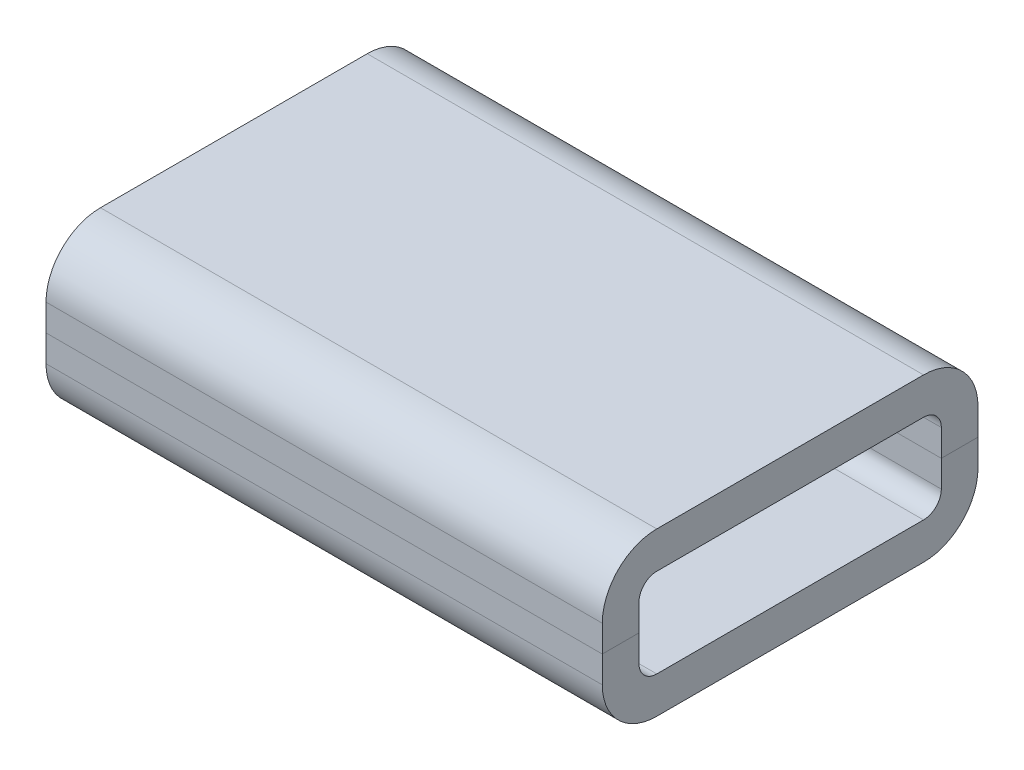
ISO-10303-21;
HEADER;
FILE_DESCRIPTION(('STEP AP214'),'2;1');
FILE_NAME('part.step','',(''),(''),'','','');
FILE_SCHEMA(('AUTOMOTIVE_DESIGN { 1 0 10303 214 1 1 1 1 }'));
ENDSEC;
DATA;
#1=APPLICATION_CONTEXT('core data for automotive mechanical design processes');
#2=APPLICATION_PROTOCOL_DEFINITION('international standard','automotive_design',2000,#1);
#3=PRODUCT_CONTEXT('',#1,'mechanical');
#4=PRODUCT('Part','Part','',(#3));
#5=PRODUCT_RELATED_PRODUCT_CATEGORY('part','',(#4));
#6=PRODUCT_DEFINITION_FORMATION('','',#4);
#7=PRODUCT_DEFINITION_CONTEXT('part definition',#1,'design');
#8=PRODUCT_DEFINITION('design','',#6,#7);
#9=PRODUCT_DEFINITION_SHAPE('','',#8);
#10=(LENGTH_UNIT() NAMED_UNIT(*) SI_UNIT(.MILLI.,.METRE.));
#11=(NAMED_UNIT(*) PLANE_ANGLE_UNIT() SI_UNIT($,.RADIAN.));
#12=(NAMED_UNIT(*) SI_UNIT($,.STERADIAN.) SOLID_ANGLE_UNIT());
#13=UNCERTAINTY_MEASURE_WITH_UNIT(LENGTH_MEASURE(1.E-05),#10,'distance_accuracy_value','');
#14=(GEOMETRIC_REPRESENTATION_CONTEXT(3) GLOBAL_UNCERTAINTY_ASSIGNED_CONTEXT((#13)) GLOBAL_UNIT_ASSIGNED_CONTEXT((#10,
#11,#12)) REPRESENTATION_CONTEXT('',''));
#15=CARTESIAN_POINT('',(0.,0.,0.));
#16=DIRECTION('',(0.,0.,1.));
#17=DIRECTION('',(1.,0.,0.));
#18=AXIS2_PLACEMENT_3D('',#15,#16,#17);
#19=CARTESIAN_POINT('',(25.025,0.,13.6));
#20=DIRECTION('',(0.,-1.,0.));
#21=DIRECTION('',(0.,0.,1.));
#22=AXIS2_PLACEMENT_3D('',#19,#20,#21);
#23=PLANE('',#22);
#24=DIRECTION('',(0.,0.,-1.));
#25=VECTOR('',#24,1.);
#26=CARTESIAN_POINT('',(-25.025,0.,13.6));
#27=LINE('',#26,#25);
#28=CARTESIAN_POINT('',(-25.025,0.,16.9));
#29=VERTEX_POINT('',#28);
#30=CARTESIAN_POINT('',(-25.025,0.,13.6));
#31=VERTEX_POINT('',#30);
#32=EDGE_CURVE('E169',#29,#31,#27,.T.);
#33=ORIENTED_EDGE('',*,*,#32,.F.);
#34=DIRECTION('',(-1.,0.,0.));
#35=VECTOR('',#34,1.);
#36=CARTESIAN_POINT('',(25.025,0.,16.9));
#37=LINE('',#36,#35);
#38=CARTESIAN_POINT('',(25.025,0.,16.9));
#39=VERTEX_POINT('',#38);
#40=EDGE_CURVE('E168',#39,#29,#37,.T.);
#41=ORIENTED_EDGE('',*,*,#40,.F.);
#42=DIRECTION('',(0.,0.,-1.));
#43=VECTOR('',#42,1.);
#44=CARTESIAN_POINT('',(25.025,0.,13.6));
#45=LINE('',#44,#43);
#46=CARTESIAN_POINT('',(25.025,0.,13.6));
#47=VERTEX_POINT('',#46);
#48=EDGE_CURVE('E199',#39,#47,#45,.T.);
#49=ORIENTED_EDGE('',*,*,#48,.T.);
#50=DIRECTION('',(-1.,0.,0.));
#51=VECTOR('',#50,1.);
#52=CARTESIAN_POINT('',(25.025,0.,13.6));
#53=LINE('',#52,#51);
#54=EDGE_CURVE('E12',#47,#31,#53,.T.);
#55=ORIENTED_EDGE('',*,*,#54,.T.);
#56=EDGE_LOOP('',(#33,#41,#49,#55));
#57=FACE_BOUND('',#56,.T.);
#58=ADVANCED_FACE('F49',(#57),#23,.F.);
#59=CARTESIAN_POINT('',(25.025,0.,13.6));
#60=DIRECTION('',(0.,0.,1.));
#61=DIRECTION('',(1.,0.,0.));
#62=AXIS2_PLACEMENT_3D('',#59,#60,#61);
#63=PLANE('',#62);
#64=DIRECTION('',(0.,-1.,0.));
#65=VECTOR('',#64,1.);
#66=CARTESIAN_POINT('',(-25.025,0.,13.6));
#67=LINE('',#66,#65);
#68=CARTESIAN_POINT('',(-25.025,-2.4,13.6));
#69=VERTEX_POINT('',#68);
#70=EDGE_CURVE('E171',#31,#69,#67,.T.);
#71=ORIENTED_EDGE('',*,*,#70,.F.);
#72=ORIENTED_EDGE('',*,*,#54,.F.);
#73=DIRECTION('',(0.,-1.,0.));
#74=VECTOR('',#73,1.);
#75=CARTESIAN_POINT('',(25.025,0.,13.6));
#76=LINE('',#75,#74);
#77=CARTESIAN_POINT('',(25.025,-2.4,13.6));
#78=VERTEX_POINT('',#77);
#79=EDGE_CURVE('E115',#47,#78,#76,.T.);
#80=ORIENTED_EDGE('',*,*,#79,.T.);
#81=DIRECTION('',(-1.,0.,0.));
#82=VECTOR('',#81,1.);
#83=CARTESIAN_POINT('',(25.025,-2.4,13.6));
#84=LINE('',#83,#82);
#85=EDGE_CURVE('E57',#78,#69,#84,.T.);
#86=ORIENTED_EDGE('',*,*,#85,.T.);
#87=EDGE_LOOP('',(#71,#72,#80,#86));
#88=FACE_BOUND('',#87,.T.);
#89=ADVANCED_FACE('F223',(#88),#63,.F.);
#90=CARTESIAN_POINT('',(25.025,-2.4,12.));
#91=DIRECTION('',(-1.,0.,0.));
#92=DIRECTION('',(0.,0.,1.));
#93=AXIS2_PLACEMENT_3D('',#90,#91,#92);
#94=CYLINDRICAL_SURFACE('',#93,1.6);
#95=CARTESIAN_POINT('',(-25.025,-2.4,12.));
#96=DIRECTION('',(1.,0.,0.));
#97=DIRECTION('',(0.,0.,1.));
#98=AXIS2_PLACEMENT_3D('',#95,#96,#97);
#99=CIRCLE('',#98,1.6);
#100=CARTESIAN_POINT('',(-25.025,-4.,12.));
#101=VERTEX_POINT('',#100);
#102=EDGE_CURVE('E174',#69,#101,#99,.T.);
#103=ORIENTED_EDGE('',*,*,#102,.F.);
#104=ORIENTED_EDGE('',*,*,#85,.F.);
#105=CARTESIAN_POINT('',(25.025,-2.4,12.));
#106=DIRECTION('',(1.,0.,0.));
#107=DIRECTION('',(0.,0.,1.));
#108=AXIS2_PLACEMENT_3D('',#105,#106,#107);
#109=CIRCLE('',#108,1.6);
#110=CARTESIAN_POINT('',(25.025,-4.,12.));
#111=VERTEX_POINT('',#110);
#112=EDGE_CURVE('E232',#78,#111,#109,.T.);
#113=ORIENTED_EDGE('',*,*,#112,.T.);
#114=DIRECTION('',(-1.,0.,0.));
#115=VECTOR('',#114,1.);
#116=CARTESIAN_POINT('',(25.025,-4.,12.));
#117=LINE('',#116,#115);
#118=EDGE_CURVE('E218',#111,#101,#117,.T.);
#119=ORIENTED_EDGE('',*,*,#118,.T.);
#120=EDGE_LOOP('',(#103,#104,#113,#119));
#121=FACE_BOUND('',#120,.T.);
#122=ADVANCED_FACE('F266',(#121),#94,.F.);
#123=CARTESIAN_POINT('',(25.025,-4.,12.));
#124=DIRECTION('',(0.,-1.,0.));
#125=DIRECTION('',(0.,0.,1.));
#126=AXIS2_PLACEMENT_3D('',#123,#124,#125);
#127=PLANE('',#126);
#128=DIRECTION('',(0.,0.,-1.));
#129=VECTOR('',#128,1.);
#130=CARTESIAN_POINT('',(-25.025,-4.,12.));
#131=LINE('',#130,#129);
#132=CARTESIAN_POINT('',(-25.025,-4.,-12.));
#133=VERTEX_POINT('',#132);
#134=EDGE_CURVE('E177',#101,#133,#131,.T.);
#135=ORIENTED_EDGE('',*,*,#134,.F.);
#136=ORIENTED_EDGE('',*,*,#118,.F.);
#137=DIRECTION('',(0.,0.,-1.));
#138=VECTOR('',#137,1.);
#139=CARTESIAN_POINT('',(25.025,-4.,12.));
#140=LINE('',#139,#138);
#141=CARTESIAN_POINT('',(25.025,-4.,-12.));
#142=VERTEX_POINT('',#141);
#143=EDGE_CURVE('E236',#111,#142,#140,.T.);
#144=ORIENTED_EDGE('',*,*,#143,.T.);
#145=DIRECTION('',(-1.,0.,0.));
#146=VECTOR('',#145,1.);
#147=CARTESIAN_POINT('',(25.025,-4.,-12.));
#148=LINE('',#147,#146);
#149=EDGE_CURVE('E215',#142,#133,#148,.T.);
#150=ORIENTED_EDGE('',*,*,#149,.T.);
#151=EDGE_LOOP('',(#135,#136,#144,#150));
#152=FACE_BOUND('',#151,.T.);
#153=ADVANCED_FACE('F265',(#152),#127,.F.);
#154=CARTESIAN_POINT('',(25.025,-2.4,-12.));
#155=DIRECTION('',(-1.,0.,0.));
#156=DIRECTION('',(0.,0.,1.));
#157=AXIS2_PLACEMENT_3D('',#154,#155,#156);
#158=CYLINDRICAL_SURFACE('',#157,1.6);
#159=CARTESIAN_POINT('',(-25.025,-2.4,-12.));
#160=DIRECTION('',(1.,0.,0.));
#161=DIRECTION('',(0.,0.,1.));
#162=AXIS2_PLACEMENT_3D('',#159,#160,#161);
#163=CIRCLE('',#162,1.6);
#164=CARTESIAN_POINT('',(-25.025,-2.4,-13.6));
#165=VERTEX_POINT('',#164);
#166=EDGE_CURVE('E180',#133,#165,#163,.T.);
#167=ORIENTED_EDGE('',*,*,#166,.F.);
#168=ORIENTED_EDGE('',*,*,#149,.F.);
#169=CARTESIAN_POINT('',(25.025,-2.4,-12.));
#170=DIRECTION('',(1.,0.,0.));
#171=DIRECTION('',(0.,0.,1.));
#172=AXIS2_PLACEMENT_3D('',#169,#170,#171);
#173=CIRCLE('',#172,1.6);
#174=CARTESIAN_POINT('',(25.025,-2.4,-13.6));
#175=VERTEX_POINT('',#174);
#176=EDGE_CURVE('E239',#142,#175,#173,.T.);
#177=ORIENTED_EDGE('',*,*,#176,.T.);
#178=DIRECTION('',(-1.,0.,0.));
#179=VECTOR('',#178,1.);
#180=CARTESIAN_POINT('',(25.025,-2.4,-13.6));
#181=LINE('',#180,#179);
#182=EDGE_CURVE('E212',#175,#165,#181,.T.);
#183=ORIENTED_EDGE('',*,*,#182,.T.);
#184=EDGE_LOOP('',(#167,#168,#177,#183));
#185=FACE_BOUND('',#184,.T.);
#186=ADVANCED_FACE('F263',(#185),#158,.F.);
#187=CARTESIAN_POINT('',(25.025,-2.4,-13.6));
#188=DIRECTION('',(0.,0.,-1.));
#189=DIRECTION('',(-1.,0.,0.));
#190=AXIS2_PLACEMENT_3D('',#187,#188,#189);
#191=PLANE('',#190);
#192=DIRECTION('',(0.,1.,0.));
#193=VECTOR('',#192,1.);
#194=CARTESIAN_POINT('',(-25.025,-2.4,-13.6));
#195=LINE('',#194,#193);
#196=CARTESIAN_POINT('',(-25.025,0.,-13.6));
#197=VERTEX_POINT('',#196);
#198=EDGE_CURVE('E183',#165,#197,#195,.T.);
#199=ORIENTED_EDGE('',*,*,#198,.F.);
#200=ORIENTED_EDGE('',*,*,#182,.F.);
#201=DIRECTION('',(0.,1.,0.));
#202=VECTOR('',#201,1.);
#203=CARTESIAN_POINT('',(25.025,-2.4,-13.6));
#204=LINE('',#203,#202);
#205=CARTESIAN_POINT('',(25.025,0.,-13.6));
#206=VERTEX_POINT('',#205);
#207=EDGE_CURVE('E242',#175,#206,#204,.T.);
#208=ORIENTED_EDGE('',*,*,#207,.T.);
#209=DIRECTION('',(-1.,0.,0.));
#210=VECTOR('',#209,1.);
#211=CARTESIAN_POINT('',(25.025,0.,-13.6));
#212=LINE('',#211,#210);
#213=EDGE_CURVE('E209',#206,#197,#212,.T.);
#214=ORIENTED_EDGE('',*,*,#213,.T.);
#215=EDGE_LOOP('',(#199,#200,#208,#214));
#216=FACE_BOUND('',#215,.T.);
#217=ADVANCED_FACE('F259',(#216),#191,.F.);
#218=CARTESIAN_POINT('',(25.025,0.,-13.6));
#219=DIRECTION('',(0.,-1.,0.));
#220=DIRECTION('',(0.,0.,1.));
#221=AXIS2_PLACEMENT_3D('',#218,#219,#220);
#222=PLANE('',#221);
#223=DIRECTION('',(0.,0.,-1.));
#224=VECTOR('',#223,1.);
#225=CARTESIAN_POINT('',(-25.025,0.,-13.6));
#226=LINE('',#225,#224);
#227=CARTESIAN_POINT('',(-25.025,0.,-16.9));
#228=VERTEX_POINT('',#227);
#229=EDGE_CURVE('E186',#197,#228,#226,.T.);
#230=ORIENTED_EDGE('',*,*,#229,.F.);
#231=ORIENTED_EDGE('',*,*,#213,.F.);
#232=DIRECTION('',(0.,0.,-1.));
#233=VECTOR('',#232,1.);
#234=CARTESIAN_POINT('',(25.025,0.,-13.6));
#235=LINE('',#234,#233);
#236=CARTESIAN_POINT('',(25.025,0.,-16.9));
#237=VERTEX_POINT('',#236);
#238=EDGE_CURVE('E245',#206,#237,#235,.T.);
#239=ORIENTED_EDGE('',*,*,#238,.T.);
#240=DIRECTION('',(-1.,0.,0.));
#241=VECTOR('',#240,1.);
#242=CARTESIAN_POINT('',(25.025,0.,-16.9));
#243=LINE('',#242,#241);
#244=EDGE_CURVE('E206',#237,#228,#243,.T.);
#245=ORIENTED_EDGE('',*,*,#244,.T.);
#246=EDGE_LOOP('',(#230,#231,#239,#245));
#247=FACE_BOUND('',#246,.T.);
#248=ADVANCED_FACE('F256',(#247),#222,.F.);
#249=CARTESIAN_POINT('',(25.025,0.,-16.9));
#250=DIRECTION('',(0.,0.,1.));
#251=DIRECTION('',(1.,0.,0.));
#252=AXIS2_PLACEMENT_3D('',#249,#250,#251);
#253=PLANE('',#252);
#254=DIRECTION('',(0.,-1.,0.));
#255=VECTOR('',#254,1.);
#256=CARTESIAN_POINT('',(-25.025,0.,-16.9));
#257=LINE('',#256,#255);
#258=CARTESIAN_POINT('',(-25.025,-2.4,-16.9));
#259=VERTEX_POINT('',#258);
#260=EDGE_CURVE('E189',#228,#259,#257,.T.);
#261=ORIENTED_EDGE('',*,*,#260,.F.);
#262=ORIENTED_EDGE('',*,*,#244,.F.);
#263=DIRECTION('',(0.,-1.,0.));
#264=VECTOR('',#263,1.);
#265=CARTESIAN_POINT('',(25.025,0.,-16.9));
#266=LINE('',#265,#264);
#267=CARTESIAN_POINT('',(25.025,-2.4,-16.9));
#268=VERTEX_POINT('',#267);
#269=EDGE_CURVE('E163',#237,#268,#266,.T.);
#270=ORIENTED_EDGE('',*,*,#269,.T.);
#271=DIRECTION('',(-1.,0.,0.));
#272=VECTOR('',#271,1.);
#273=CARTESIAN_POINT('',(25.025,-2.4,-16.9));
#274=LINE('',#273,#272);
#275=EDGE_CURVE('E203',#268,#259,#274,.T.);
#276=ORIENTED_EDGE('',*,*,#275,.T.);
#277=EDGE_LOOP('',(#261,#262,#270,#276));
#278=FACE_BOUND('',#277,.T.);
#279=ADVANCED_FACE('F250',(#278),#253,.F.);
#280=CARTESIAN_POINT('',(25.025,-2.4,-12.));
#281=DIRECTION('',(-1.,0.,0.));
#282=DIRECTION('',(0.,0.,1.));
#283=AXIS2_PLACEMENT_3D('',#280,#281,#282);
#284=CYLINDRICAL_SURFACE('',#283,4.9);
#285=CARTESIAN_POINT('',(-25.025,-2.4,-12.));
#286=DIRECTION('',(-1.,0.,0.));
#287=DIRECTION('',(0.,0.,-1.));
#288=AXIS2_PLACEMENT_3D('',#285,#286,#287);
#289=CIRCLE('',#288,4.9);
#290=CARTESIAN_POINT('',(-25.025,-7.3,-12.));
#291=VERTEX_POINT('',#290);
#292=EDGE_CURVE('E192',#259,#291,#289,.T.);
#293=ORIENTED_EDGE('',*,*,#292,.F.);
#294=ORIENTED_EDGE('',*,*,#275,.F.);
#295=CARTESIAN_POINT('',(25.025,-2.4,-12.));
#296=DIRECTION('',(-1.,0.,0.));
#297=DIRECTION('',(0.,0.,-1.));
#298=AXIS2_PLACEMENT_3D('',#295,#296,#297);
#299=CIRCLE('',#298,4.9);
#300=CARTESIAN_POINT('',(25.025,-7.3,-12.));
#301=VERTEX_POINT('',#300);
#302=EDGE_CURVE('E161',#268,#301,#299,.T.);
#303=ORIENTED_EDGE('',*,*,#302,.T.);
#304=DIRECTION('',(-1.,0.,0.));
#305=VECTOR('',#304,1.);
#306=CARTESIAN_POINT('',(25.025,-7.3,-12.));
#307=LINE('',#306,#305);
#308=EDGE_CURVE('E155',#301,#291,#307,.T.);
#309=ORIENTED_EDGE('',*,*,#308,.T.);
#310=EDGE_LOOP('',(#293,#294,#303,#309));
#311=FACE_BOUND('',#310,.T.);
#312=ADVANCED_FACE('F254',(#311),#284,.T.);
#313=CARTESIAN_POINT('',(25.025,-7.3,-12.));
#314=DIRECTION('',(0.,1.,0.));
#315=DIRECTION('',(0.,0.,-1.));
#316=AXIS2_PLACEMENT_3D('',#313,#314,#315);
#317=PLANE('',#316);
#318=DIRECTION('',(0.,0.,1.));
#319=VECTOR('',#318,1.);
#320=CARTESIAN_POINT('',(-25.025,-7.3,-12.));
#321=LINE('',#320,#319);
#322=CARTESIAN_POINT('',(-25.025,-7.3,12.));
#323=VERTEX_POINT('',#322);
#324=EDGE_CURVE('E195',#291,#323,#321,.T.);
#325=ORIENTED_EDGE('',*,*,#324,.F.);
#326=ORIENTED_EDGE('',*,*,#308,.F.);
#327=DIRECTION('',(0.,0.,1.));
#328=VECTOR('',#327,1.);
#329=CARTESIAN_POINT('',(25.025,-7.3,-12.));
#330=LINE('',#329,#328);
#331=CARTESIAN_POINT('',(25.025,-7.3,12.));
#332=VERTEX_POINT('',#331);
#333=EDGE_CURVE('E145',#301,#332,#330,.T.);
#334=ORIENTED_EDGE('',*,*,#333,.T.);
#335=DIRECTION('',(-1.,0.,0.));
#336=VECTOR('',#335,1.);
#337=CARTESIAN_POINT('',(25.025,-7.3,12.));
#338=LINE('',#337,#336);
#339=EDGE_CURVE('E150',#332,#323,#338,.T.);
#340=ORIENTED_EDGE('',*,*,#339,.T.);
#341=EDGE_LOOP('',(#325,#326,#334,#340));
#342=FACE_BOUND('',#341,.T.);
#343=ADVANCED_FACE('F158',(#342),#317,.F.);
#344=CARTESIAN_POINT('',(25.025,-2.4,12.));
#345=DIRECTION('',(-1.,0.,0.));
#346=DIRECTION('',(0.,0.,1.));
#347=AXIS2_PLACEMENT_3D('',#344,#345,#346);
#348=CYLINDRICAL_SURFACE('',#347,4.9);
#349=CARTESIAN_POINT('',(-25.025,-2.4,12.));
#350=DIRECTION('',(-1.,0.,0.));
#351=DIRECTION('',(0.,0.,-1.));
#352=AXIS2_PLACEMENT_3D('',#349,#350,#351);
#353=CIRCLE('',#352,4.9);
#354=CARTESIAN_POINT('',(-25.025,-2.4,16.9));
#355=VERTEX_POINT('',#354);
#356=EDGE_CURVE('E152',#323,#355,#353,.T.);
#357=ORIENTED_EDGE('',*,*,#356,.F.);
#358=ORIENTED_EDGE('',*,*,#339,.F.);
#359=CARTESIAN_POINT('',(25.025,-2.4,12.));
#360=DIRECTION('',(-1.,0.,0.));
#361=DIRECTION('',(0.,0.,-1.));
#362=AXIS2_PLACEMENT_3D('',#359,#360,#361);
#363=CIRCLE('',#362,4.9);
#364=CARTESIAN_POINT('',(25.025,-2.4,16.9));
#365=VERTEX_POINT('',#364);
#366=EDGE_CURVE('E141',#332,#365,#363,.T.);
#367=ORIENTED_EDGE('',*,*,#366,.T.);
#368=DIRECTION('',(-1.,0.,0.));
#369=VECTOR('',#368,1.);
#370=CARTESIAN_POINT('',(25.025,-2.4,16.9));
#371=LINE('',#370,#369);
#372=EDGE_CURVE('E156',#365,#355,#371,.T.);
#373=ORIENTED_EDGE('',*,*,#372,.T.);
#374=EDGE_LOOP('',(#357,#358,#367,#373));
#375=FACE_BOUND('',#374,.T.);
#376=ADVANCED_FACE('F151',(#375),#348,.T.);
#377=CARTESIAN_POINT('',(25.025,0.,16.9));
#378=DIRECTION('',(0.,0.,-1.));
#379=DIRECTION('',(-1.,0.,0.));
#380=AXIS2_PLACEMENT_3D('',#377,#378,#379);
#381=PLANE('',#380);
#382=DIRECTION('',(0.,1.,0.));
#383=VECTOR('',#382,1.);
#384=CARTESIAN_POINT('',(-25.025,0.,16.9));
#385=LINE('',#384,#383);
#386=EDGE_CURVE('E103',#355,#29,#385,.T.);
#387=ORIENTED_EDGE('',*,*,#386,.F.);
#388=ORIENTED_EDGE('',*,*,#372,.F.);
#389=DIRECTION('',(0.,1.,0.));
#390=VECTOR('',#389,1.);
#391=CARTESIAN_POINT('',(25.025,0.,16.9));
#392=LINE('',#391,#390);
#393=EDGE_CURVE('E65',#365,#39,#392,.T.);
#394=ORIENTED_EDGE('',*,*,#393,.T.);
#395=ORIENTED_EDGE('',*,*,#40,.T.);
#396=EDGE_LOOP('',(#387,#388,#394,#395));
#397=FACE_BOUND('',#396,.T.);
#398=ADVANCED_FACE('F357',(#397),#381,.F.);
#399=CARTESIAN_POINT('',(25.025,-2.4,12.));
#400=DIRECTION('',(1.,0.,0.));
#401=DIRECTION('',(0.,0.,-1.));
#402=AXIS2_PLACEMENT_3D('',#399,#400,#401);
#403=PLANE('',#402);
#404=ORIENTED_EDGE('',*,*,#48,.F.);
#405=ORIENTED_EDGE('',*,*,#393,.F.);
#406=ORIENTED_EDGE('',*,*,#366,.F.);
#407=ORIENTED_EDGE('',*,*,#333,.F.);
#408=ORIENTED_EDGE('',*,*,#302,.F.);
#409=ORIENTED_EDGE('',*,*,#269,.F.);
#410=ORIENTED_EDGE('',*,*,#238,.F.);
#411=ORIENTED_EDGE('',*,*,#207,.F.);
#412=ORIENTED_EDGE('',*,*,#176,.F.);
#413=ORIENTED_EDGE('',*,*,#143,.F.);
#414=ORIENTED_EDGE('',*,*,#112,.F.);
#415=ORIENTED_EDGE('',*,*,#79,.F.);
#416=EDGE_LOOP('',(#404,#405,#406,#407,#408,#409,#410,#411,#412,#413,#414,#415));
#417=FACE_BOUND('',#416,.T.);
#418=ADVANCED_FACE('F143',(#417),#403,.T.);
#419=CARTESIAN_POINT('',(-25.025,-2.4,12.));
#420=DIRECTION('',(1.,0.,0.));
#421=DIRECTION('',(0.,0.,-1.));
#422=AXIS2_PLACEMENT_3D('',#419,#420,#421);
#423=PLANE('',#422);
#424=ORIENTED_EDGE('',*,*,#32,.T.);
#425=ORIENTED_EDGE('',*,*,#70,.T.);
#426=ORIENTED_EDGE('',*,*,#102,.T.);
#427=ORIENTED_EDGE('',*,*,#134,.T.);
#428=ORIENTED_EDGE('',*,*,#166,.T.);
#429=ORIENTED_EDGE('',*,*,#198,.T.);
#430=ORIENTED_EDGE('',*,*,#229,.T.);
#431=ORIENTED_EDGE('',*,*,#260,.T.);
#432=ORIENTED_EDGE('',*,*,#292,.T.);
#433=ORIENTED_EDGE('',*,*,#324,.T.);
#434=ORIENTED_EDGE('',*,*,#356,.T.);
#435=ORIENTED_EDGE('',*,*,#386,.T.);
#436=EDGE_LOOP('',(#424,#425,#426,#427,#428,#429,#430,#431,#432,#433,#434,#435));
#437=FACE_BOUND('',#436,.T.);
#438=ADVANCED_FACE('F226',(#437),#423,.F.);
#439=CLOSED_SHELL('',(#58,#89,#122,#153,#186,#217,#248,#279,#312,#343,#376,#398,#418,#438));
#440=MANIFOLD_SOLID_BREP('B2',#439);
#441=CARTESIAN_POINT('',(25.025,0.,13.6));
#442=DIRECTION('',(0.,1.,0.));
#443=DIRECTION('',(0.,0.,1.));
#444=AXIS2_PLACEMENT_3D('',#441,#442,#443);
#445=PLANE('',#444);
#446=DIRECTION('',(0.,0.,-1.));
#447=VECTOR('',#446,1.);
#448=CARTESIAN_POINT('',(-25.025,0.,13.6));
#449=LINE('',#448,#447);
#450=CARTESIAN_POINT('',(-25.025,0.,16.9));
#451=VERTEX_POINT('',#450);
#452=CARTESIAN_POINT('',(-25.025,0.,13.6));
#453=VERTEX_POINT('',#452);
#454=EDGE_CURVE('E529',#451,#453,#449,.T.);
#455=ORIENTED_EDGE('',*,*,#454,.T.);
#456=DIRECTION('',(-1.,0.,0.));
#457=VECTOR('',#456,1.);
#458=CARTESIAN_POINT('',(25.025,0.,13.6));
#459=LINE('',#458,#457);
#460=CARTESIAN_POINT('',(25.025,0.,13.6));
#461=VERTEX_POINT('',#460);
#462=EDGE_CURVE('E47',#461,#453,#459,.T.);
#463=ORIENTED_EDGE('',*,*,#462,.F.);
#464=DIRECTION('',(0.,0.,-1.));
#465=VECTOR('',#464,1.);
#466=CARTESIAN_POINT('',(25.025,0.,13.6));
#467=LINE('',#466,#465);
#468=CARTESIAN_POINT('',(25.025,0.,16.9));
#469=VERTEX_POINT('',#468);
#470=EDGE_CURVE('E551',#469,#461,#467,.T.);
#471=ORIENTED_EDGE('',*,*,#470,.F.);
#472=DIRECTION('',(-1.,0.,0.));
#473=VECTOR('',#472,1.);
#474=CARTESIAN_POINT('',(25.025,0.,16.9));
#475=LINE('',#474,#473);
#476=EDGE_CURVE('E525',#469,#451,#475,.T.);
#477=ORIENTED_EDGE('',*,*,#476,.T.);
#478=EDGE_LOOP('',(#455,#463,#471,#477));
#479=FACE_BOUND('',#478,.T.);
#480=ADVANCED_FACE('F409',(#479),#445,.F.);
#481=CARTESIAN_POINT('',(25.025,0.,13.6));
#482=DIRECTION('',(0.,0.,1.));
#483=DIRECTION('',(1.,0.,0.));
#484=AXIS2_PLACEMENT_3D('',#481,#482,#483);
#485=PLANE('',#484);
#486=DIRECTION('',(0.,1.,0.));
#487=VECTOR('',#486,1.);
#488=CARTESIAN_POINT('',(-25.025,0.,13.6));
#489=LINE('',#488,#487);
#490=CARTESIAN_POINT('',(-25.025,2.4,13.6));
#491=VERTEX_POINT('',#490);
#492=EDGE_CURVE('E532',#453,#491,#489,.T.);
#493=ORIENTED_EDGE('',*,*,#492,.T.);
#494=DIRECTION('',(-1.,0.,0.));
#495=VECTOR('',#494,1.);
#496=CARTESIAN_POINT('',(25.025,2.4,13.6));
#497=LINE('',#496,#495);
#498=CARTESIAN_POINT('',(25.025,2.4,13.6));
#499=VERTEX_POINT('',#498);
#500=EDGE_CURVE('E417',#499,#491,#497,.T.);
#501=ORIENTED_EDGE('',*,*,#500,.F.);
#502=DIRECTION('',(0.,1.,0.));
#503=VECTOR('',#502,1.);
#504=CARTESIAN_POINT('',(25.025,0.,13.6));
#505=LINE('',#504,#503);
#506=EDGE_CURVE('E480',#461,#499,#505,.T.);
#507=ORIENTED_EDGE('',*,*,#506,.F.);
#508=ORIENTED_EDGE('',*,*,#462,.T.);
#509=EDGE_LOOP('',(#493,#501,#507,#508));
#510=FACE_BOUND('',#509,.T.);
#511=ADVANCED_FACE('F629',(#510),#485,.F.);
#512=CARTESIAN_POINT('',(25.025,2.4,12.));
#513=DIRECTION('',(-1.,0.,0.));
#514=DIRECTION('',(0.,0.,1.));
#515=AXIS2_PLACEMENT_3D('',#512,#513,#514);
#516=CYLINDRICAL_SURFACE('',#515,1.6);
#517=CARTESIAN_POINT('',(-25.025,2.4,12.));
#518=DIRECTION('',(-1.,0.,0.));
#519=DIRECTION('',(0.,0.,1.));
#520=AXIS2_PLACEMENT_3D('',#517,#518,#519);
#521=CIRCLE('',#520,1.6);
#522=CARTESIAN_POINT('',(-25.025,4.,12.));
#523=VERTEX_POINT('',#522);
#524=EDGE_CURVE('E534',#491,#523,#521,.T.);
#525=ORIENTED_EDGE('',*,*,#524,.T.);
#526=DIRECTION('',(-1.,0.,0.));
#527=VECTOR('',#526,1.);
#528=CARTESIAN_POINT('',(25.025,4.,12.));
#529=LINE('',#528,#527);
#530=CARTESIAN_POINT('',(25.025,4.,12.));
#531=VERTEX_POINT('',#530);
#532=EDGE_CURVE('E570',#531,#523,#529,.T.);
#533=ORIENTED_EDGE('',*,*,#532,.F.);
#534=CARTESIAN_POINT('',(25.025,2.4,12.));
#535=DIRECTION('',(-1.,0.,0.));
#536=DIRECTION('',(0.,0.,1.));
#537=AXIS2_PLACEMENT_3D('',#534,#535,#536);
#538=CIRCLE('',#537,1.6);
#539=EDGE_CURVE('E578',#499,#531,#538,.T.);
#540=ORIENTED_EDGE('',*,*,#539,.F.);
#541=ORIENTED_EDGE('',*,*,#500,.T.);
#542=EDGE_LOOP('',(#525,#533,#540,#541));
#543=FACE_BOUND('',#542,.T.);
#544=ADVANCED_FACE('F576',(#543),#516,.F.);
#545=CARTESIAN_POINT('',(25.025,4.,12.));
#546=DIRECTION('',(0.,1.,0.));
#547=DIRECTION('',(0.,0.,1.));
#548=AXIS2_PLACEMENT_3D('',#545,#546,#547);
#549=PLANE('',#548);
#550=DIRECTION('',(0.,0.,-1.));
#551=VECTOR('',#550,1.);
#552=CARTESIAN_POINT('',(-25.025,4.,12.));
#553=LINE('',#552,#551);
#554=CARTESIAN_POINT('',(-25.025,4.,-12.));
#555=VERTEX_POINT('',#554);
#556=EDGE_CURVE('E536',#523,#555,#553,.T.);
#557=ORIENTED_EDGE('',*,*,#556,.T.);
#558=DIRECTION('',(-1.,0.,0.));
#559=VECTOR('',#558,1.);
#560=CARTESIAN_POINT('',(25.025,4.,-12.));
#561=LINE('',#560,#559);
#562=CARTESIAN_POINT('',(25.025,4.,-12.));
#563=VERTEX_POINT('',#562);
#564=EDGE_CURVE('E567',#563,#555,#561,.T.);
#565=ORIENTED_EDGE('',*,*,#564,.F.);
#566=DIRECTION('',(0.,0.,-1.));
#567=VECTOR('',#566,1.);
#568=CARTESIAN_POINT('',(25.025,4.,12.));
#569=LINE('',#568,#567);
#570=EDGE_CURVE('E596',#531,#563,#569,.T.);
#571=ORIENTED_EDGE('',*,*,#570,.F.);
#572=ORIENTED_EDGE('',*,*,#532,.T.);
#573=EDGE_LOOP('',(#557,#565,#571,#572));
#574=FACE_BOUND('',#573,.T.);
#575=ADVANCED_FACE('F587',(#574),#549,.F.);
#576=CARTESIAN_POINT('',(25.025,2.4,-12.));
#577=DIRECTION('',(-1.,0.,0.));
#578=DIRECTION('',(0.,0.,1.));
#579=AXIS2_PLACEMENT_3D('',#576,#577,#578);
#580=CYLINDRICAL_SURFACE('',#579,1.6);
#581=CARTESIAN_POINT('',(-25.025,2.4,-12.));
#582=DIRECTION('',(-1.,0.,0.));
#583=DIRECTION('',(0.,0.,1.));
#584=AXIS2_PLACEMENT_3D('',#581,#582,#583);
#585=CIRCLE('',#584,1.6);
#586=CARTESIAN_POINT('',(-25.025,2.4,-13.6));
#587=VERTEX_POINT('',#586);
#588=EDGE_CURVE('E538',#555,#587,#585,.T.);
#589=ORIENTED_EDGE('',*,*,#588,.T.);
#590=DIRECTION('',(-1.,0.,0.));
#591=VECTOR('',#590,1.);
#592=CARTESIAN_POINT('',(25.025,2.4,-13.6));
#593=LINE('',#592,#591);
#594=CARTESIAN_POINT('',(25.025,2.4,-13.6));
#595=VERTEX_POINT('',#594);
#596=EDGE_CURVE('E564',#595,#587,#593,.T.);
#597=ORIENTED_EDGE('',*,*,#596,.F.);
#598=CARTESIAN_POINT('',(25.025,2.4,-12.));
#599=DIRECTION('',(-1.,0.,0.));
#600=DIRECTION('',(0.,0.,1.));
#601=AXIS2_PLACEMENT_3D('',#598,#599,#600);
#602=CIRCLE('',#601,1.6);
#603=EDGE_CURVE('E593',#563,#595,#602,.T.);
#604=ORIENTED_EDGE('',*,*,#603,.F.);
#605=ORIENTED_EDGE('',*,*,#564,.T.);
#606=EDGE_LOOP('',(#589,#597,#604,#605));
#607=FACE_BOUND('',#606,.T.);
#608=ADVANCED_FACE('F591',(#607),#580,.F.);
#609=CARTESIAN_POINT('',(25.025,2.4,-13.6));
#610=DIRECTION('',(0.,0.,-1.));
#611=DIRECTION('',(-1.,0.,0.));
#612=AXIS2_PLACEMENT_3D('',#609,#610,#611);
#613=PLANE('',#612);
#614=DIRECTION('',(0.,-1.,0.));
#615=VECTOR('',#614,1.);
#616=CARTESIAN_POINT('',(-25.025,2.4,-13.6));
#617=LINE('',#616,#615);
#618=CARTESIAN_POINT('',(-25.025,0.,-13.6));
#619=VERTEX_POINT('',#618);
#620=EDGE_CURVE('E540',#587,#619,#617,.T.);
#621=ORIENTED_EDGE('',*,*,#620,.T.);
#622=DIRECTION('',(-1.,0.,0.));
#623=VECTOR('',#622,1.);
#624=CARTESIAN_POINT('',(25.025,0.,-13.6));
#625=LINE('',#624,#623);
#626=CARTESIAN_POINT('',(25.025,0.,-13.6));
#627=VERTEX_POINT('',#626);
#628=EDGE_CURVE('E561',#627,#619,#625,.T.);
#629=ORIENTED_EDGE('',*,*,#628,.F.);
#630=DIRECTION('',(0.,-1.,0.));
#631=VECTOR('',#630,1.);
#632=CARTESIAN_POINT('',(25.025,2.4,-13.6));
#633=LINE('',#632,#631);
#634=EDGE_CURVE('E595',#595,#627,#633,.T.);
#635=ORIENTED_EDGE('',*,*,#634,.F.);
#636=ORIENTED_EDGE('',*,*,#596,.T.);
#637=EDGE_LOOP('',(#621,#629,#635,#636));
#638=FACE_BOUND('',#637,.T.);
#639=ADVANCED_FACE('F642',(#638),#613,.F.);
#640=CARTESIAN_POINT('',(25.025,0.,-13.6));
#641=DIRECTION('',(0.,1.,0.));
#642=DIRECTION('',(0.,0.,1.));
#643=AXIS2_PLACEMENT_3D('',#640,#641,#642);
#644=PLANE('',#643);
#645=DIRECTION('',(0.,0.,-1.));
#646=VECTOR('',#645,1.);
#647=CARTESIAN_POINT('',(-25.025,0.,-13.6));
#648=LINE('',#647,#646);
#649=CARTESIAN_POINT('',(-25.025,0.,-16.9));
#650=VERTEX_POINT('',#649);
#651=EDGE_CURVE('E542',#619,#650,#648,.T.);
#652=ORIENTED_EDGE('',*,*,#651,.T.);
#653=DIRECTION('',(-1.,0.,0.));
#654=VECTOR('',#653,1.);
#655=CARTESIAN_POINT('',(25.025,0.,-16.9));
#656=LINE('',#655,#654);
#657=CARTESIAN_POINT('',(25.025,0.,-16.9));
#658=VERTEX_POINT('',#657);
#659=EDGE_CURVE('E558',#658,#650,#656,.T.);
#660=ORIENTED_EDGE('',*,*,#659,.F.);
#661=DIRECTION('',(0.,0.,-1.));
#662=VECTOR('',#661,1.);
#663=CARTESIAN_POINT('',(25.025,0.,-13.6));
#664=LINE('',#663,#662);
#665=EDGE_CURVE('E598',#627,#658,#664,.T.);
#666=ORIENTED_EDGE('',*,*,#665,.F.);
#667=ORIENTED_EDGE('',*,*,#628,.T.);
#668=EDGE_LOOP('',(#652,#660,#666,#667));
#669=FACE_BOUND('',#668,.T.);
#670=ADVANCED_FACE('F645',(#669),#644,.F.);
#671=CARTESIAN_POINT('',(25.025,0.,-16.9));
#672=DIRECTION('',(0.,0.,1.));
#673=DIRECTION('',(1.,0.,0.));
#674=AXIS2_PLACEMENT_3D('',#671,#672,#673);
#675=PLANE('',#674);
#676=DIRECTION('',(0.,1.,0.));
#677=VECTOR('',#676,1.);
#678=CARTESIAN_POINT('',(-25.025,0.,-16.9));
#679=LINE('',#678,#677);
#680=CARTESIAN_POINT('',(-25.025,2.4,-16.9));
#681=VERTEX_POINT('',#680);
#682=EDGE_CURVE('E544',#650,#681,#679,.T.);
#683=ORIENTED_EDGE('',*,*,#682,.T.);
#684=DIRECTION('',(-1.,0.,0.));
#685=VECTOR('',#684,1.);
#686=CARTESIAN_POINT('',(25.025,2.4,-16.9));
#687=LINE('',#686,#685);
#688=CARTESIAN_POINT('',(25.025,2.4,-16.9));
#689=VERTEX_POINT('',#688);
#690=EDGE_CURVE('E555',#689,#681,#687,.T.);
#691=ORIENTED_EDGE('',*,*,#690,.F.);
#692=DIRECTION('',(0.,1.,0.));
#693=VECTOR('',#692,1.);
#694=CARTESIAN_POINT('',(25.025,0.,-16.9));
#695=LINE('',#694,#693);
#696=EDGE_CURVE('E604',#658,#689,#695,.T.);
#697=ORIENTED_EDGE('',*,*,#696,.F.);
#698=ORIENTED_EDGE('',*,*,#659,.T.);
#699=EDGE_LOOP('',(#683,#691,#697,#698));
#700=FACE_BOUND('',#699,.T.);
#701=ADVANCED_FACE('F610',(#700),#675,.F.);
#702=CARTESIAN_POINT('',(25.025,2.4,-12.));
#703=DIRECTION('',(-1.,0.,0.));
#704=DIRECTION('',(0.,0.,1.));
#705=AXIS2_PLACEMENT_3D('',#702,#703,#704);
#706=CYLINDRICAL_SURFACE('',#705,4.9);
#707=CARTESIAN_POINT('',(-25.025,2.4,-12.));
#708=DIRECTION('',(1.,0.,0.));
#709=DIRECTION('',(0.,0.,-1.));
#710=AXIS2_PLACEMENT_3D('',#707,#708,#709);
#711=CIRCLE('',#710,4.9);
#712=CARTESIAN_POINT('',(-25.025,7.3,-12.));
#713=VERTEX_POINT('',#712);
#714=EDGE_CURVE('E546',#681,#713,#711,.T.);
#715=ORIENTED_EDGE('',*,*,#714,.T.);
#716=DIRECTION('',(-1.,0.,0.));
#717=VECTOR('',#716,1.);
#718=CARTESIAN_POINT('',(25.025,7.3,-12.));
#719=LINE('',#718,#717);
#720=CARTESIAN_POINT('',(25.025,7.3,-12.));
#721=VERTEX_POINT('',#720);
#722=EDGE_CURVE('E520',#721,#713,#719,.T.);
#723=ORIENTED_EDGE('',*,*,#722,.F.);
#724=CARTESIAN_POINT('',(25.025,2.4,-12.));
#725=DIRECTION('',(1.,0.,0.));
#726=DIRECTION('',(0.,0.,-1.));
#727=AXIS2_PLACEMENT_3D('',#724,#725,#726);
#728=CIRCLE('',#727,4.9);
#729=EDGE_CURVE('E511',#689,#721,#728,.T.);
#730=ORIENTED_EDGE('',*,*,#729,.F.);
#731=ORIENTED_EDGE('',*,*,#690,.T.);
#732=EDGE_LOOP('',(#715,#723,#730,#731));
#733=FACE_BOUND('',#732,.T.);
#734=ADVANCED_FACE('F614',(#733),#706,.T.);
#735=CARTESIAN_POINT('',(25.025,7.3,-12.));
#736=DIRECTION('',(0.,-1.,0.));
#737=DIRECTION('',(0.,0.,-1.));
#738=AXIS2_PLACEMENT_3D('',#735,#736,#737);
#739=PLANE('',#738);
#740=DIRECTION('',(0.,0.,1.));
#741=VECTOR('',#740,1.);
#742=CARTESIAN_POINT('',(-25.025,7.3,-12.));
#743=LINE('',#742,#741);
#744=CARTESIAN_POINT('',(-25.025,7.3,12.));
#745=VERTEX_POINT('',#744);
#746=EDGE_CURVE('E519',#713,#745,#743,.T.);
#747=ORIENTED_EDGE('',*,*,#746,.T.);
#748=DIRECTION('',(-1.,0.,0.));
#749=VECTOR('',#748,1.);
#750=CARTESIAN_POINT('',(25.025,7.3,12.));
#751=LINE('',#750,#749);
#752=CARTESIAN_POINT('',(25.025,7.3,12.));
#753=VERTEX_POINT('',#752);
#754=EDGE_CURVE('E516',#753,#745,#751,.T.);
#755=ORIENTED_EDGE('',*,*,#754,.F.);
#756=DIRECTION('',(0.,0.,1.));
#757=VECTOR('',#756,1.);
#758=CARTESIAN_POINT('',(25.025,7.3,-12.));
#759=LINE('',#758,#757);
#760=EDGE_CURVE('E505',#721,#753,#759,.T.);
#761=ORIENTED_EDGE('',*,*,#760,.F.);
#762=ORIENTED_EDGE('',*,*,#722,.T.);
#763=EDGE_LOOP('',(#747,#755,#761,#762));
#764=FACE_BOUND('',#763,.T.);
#765=ADVANCED_FACE('F517',(#764),#739,.F.);
#766=CARTESIAN_POINT('',(25.025,2.4,12.));
#767=DIRECTION('',(-1.,0.,0.));
#768=DIRECTION('',(0.,0.,1.));
#769=AXIS2_PLACEMENT_3D('',#766,#767,#768);
#770=CYLINDRICAL_SURFACE('',#769,4.9);
#771=CARTESIAN_POINT('',(-25.025,2.4,12.));
#772=DIRECTION('',(1.,0.,0.));
#773=DIRECTION('',(0.,0.,-1.));
#774=AXIS2_PLACEMENT_3D('',#771,#772,#773);
#775=CIRCLE('',#774,4.9);
#776=CARTESIAN_POINT('',(-25.025,2.4,16.9));
#777=VERTEX_POINT('',#776);
#778=EDGE_CURVE('E466',#745,#777,#775,.T.);
#779=ORIENTED_EDGE('',*,*,#778,.T.);
#780=DIRECTION('',(-1.,0.,0.));
#781=VECTOR('',#780,1.);
#782=CARTESIAN_POINT('',(25.025,2.4,16.9));
#783=LINE('',#782,#781);
#784=CARTESIAN_POINT('',(25.025,2.4,16.9));
#785=VERTEX_POINT('',#784);
#786=EDGE_CURVE('E521',#785,#777,#783,.T.);
#787=ORIENTED_EDGE('',*,*,#786,.F.);
#788=CARTESIAN_POINT('',(25.025,2.4,12.));
#789=DIRECTION('',(1.,0.,0.));
#790=DIRECTION('',(0.,0.,-1.));
#791=AXIS2_PLACEMENT_3D('',#788,#789,#790);
#792=CIRCLE('',#791,4.9);
#793=EDGE_CURVE('E509',#753,#785,#792,.T.);
#794=ORIENTED_EDGE('',*,*,#793,.F.);
#795=ORIENTED_EDGE('',*,*,#754,.T.);
#796=EDGE_LOOP('',(#779,#787,#794,#795));
#797=FACE_BOUND('',#796,.T.);
#798=ADVANCED_FACE('F523',(#797),#770,.T.);
#799=CARTESIAN_POINT('',(25.025,0.,16.9));
#800=DIRECTION('',(0.,0.,-1.));
#801=DIRECTION('',(-1.,0.,0.));
#802=AXIS2_PLACEMENT_3D('',#799,#800,#801);
#803=PLANE('',#802);
#804=DIRECTION('',(0.,-1.,0.));
#805=VECTOR('',#804,1.);
#806=CARTESIAN_POINT('',(-25.025,0.,16.9));
#807=LINE('',#806,#805);
#808=EDGE_CURVE('E472',#777,#451,#807,.T.);
#809=ORIENTED_EDGE('',*,*,#808,.T.);
#810=ORIENTED_EDGE('',*,*,#476,.F.);
#811=DIRECTION('',(0.,-1.,0.));
#812=VECTOR('',#811,1.);
#813=CARTESIAN_POINT('',(25.025,0.,16.9));
#814=LINE('',#813,#812);
#815=EDGE_CURVE('E425',#785,#469,#814,.T.);
#816=ORIENTED_EDGE('',*,*,#815,.F.);
#817=ORIENTED_EDGE('',*,*,#786,.T.);
#818=EDGE_LOOP('',(#809,#810,#816,#817));
#819=FACE_BOUND('',#818,.T.);
#820=ADVANCED_FACE('F618',(#819),#803,.F.);
#821=CARTESIAN_POINT('',(25.025,2.4,12.));
#822=DIRECTION('',(1.,0.,0.));
#823=DIRECTION('',(0.,0.,-1.));
#824=AXIS2_PLACEMENT_3D('',#821,#822,#823);
#825=PLANE('',#824);
#826=ORIENTED_EDGE('',*,*,#470,.T.);
#827=ORIENTED_EDGE('',*,*,#506,.T.);
#828=ORIENTED_EDGE('',*,*,#539,.T.);
#829=ORIENTED_EDGE('',*,*,#570,.T.);
#830=ORIENTED_EDGE('',*,*,#603,.T.);
#831=ORIENTED_EDGE('',*,*,#634,.T.);
#832=ORIENTED_EDGE('',*,*,#665,.T.);
#833=ORIENTED_EDGE('',*,*,#696,.T.);
#834=ORIENTED_EDGE('',*,*,#729,.T.);
#835=ORIENTED_EDGE('',*,*,#760,.T.);
#836=ORIENTED_EDGE('',*,*,#793,.T.);
#837=ORIENTED_EDGE('',*,*,#815,.T.);
#838=EDGE_LOOP('',(#826,#827,#828,#829,#830,#831,#832,#833,#834,#835,#836,#837));
#839=FACE_BOUND('',#838,.T.);
#840=ADVANCED_FACE('F507',(#839),#825,.T.);
#841=CARTESIAN_POINT('',(-25.025,2.4,12.));
#842=DIRECTION('',(1.,0.,0.));
#843=DIRECTION('',(0.,0.,-1.));
#844=AXIS2_PLACEMENT_3D('',#841,#842,#843);
#845=PLANE('',#844);
#846=ORIENTED_EDGE('',*,*,#454,.F.);
#847=ORIENTED_EDGE('',*,*,#808,.F.);
#848=ORIENTED_EDGE('',*,*,#778,.F.);
#849=ORIENTED_EDGE('',*,*,#746,.F.);
#850=ORIENTED_EDGE('',*,*,#714,.F.);
#851=ORIENTED_EDGE('',*,*,#682,.F.);
#852=ORIENTED_EDGE('',*,*,#651,.F.);
#853=ORIENTED_EDGE('',*,*,#620,.F.);
#854=ORIENTED_EDGE('',*,*,#588,.F.);
#855=ORIENTED_EDGE('',*,*,#556,.F.);
#856=ORIENTED_EDGE('',*,*,#524,.F.);
#857=ORIENTED_EDGE('',*,*,#492,.F.);
#858=EDGE_LOOP('',(#846,#847,#848,#849,#850,#851,#852,#853,#854,#855,#856,#857));
#859=FACE_BOUND('',#858,.T.);
#860=ADVANCED_FACE('F582',(#859),#845,.F.);
#861=CLOSED_SHELL('',(#480,#511,#544,#575,#608,#639,#670,#701,#734,#765,#798,#820,#840,#860));
#862=MANIFOLD_SOLID_BREP('B6',#861);
#863=ADVANCED_BREP_SHAPE_REPRESENTATION('',(#18,#440,#862),#14);
#864=SHAPE_DEFINITION_REPRESENTATION(#9,#863);
ENDSEC;
END-ISO-10303-21;
